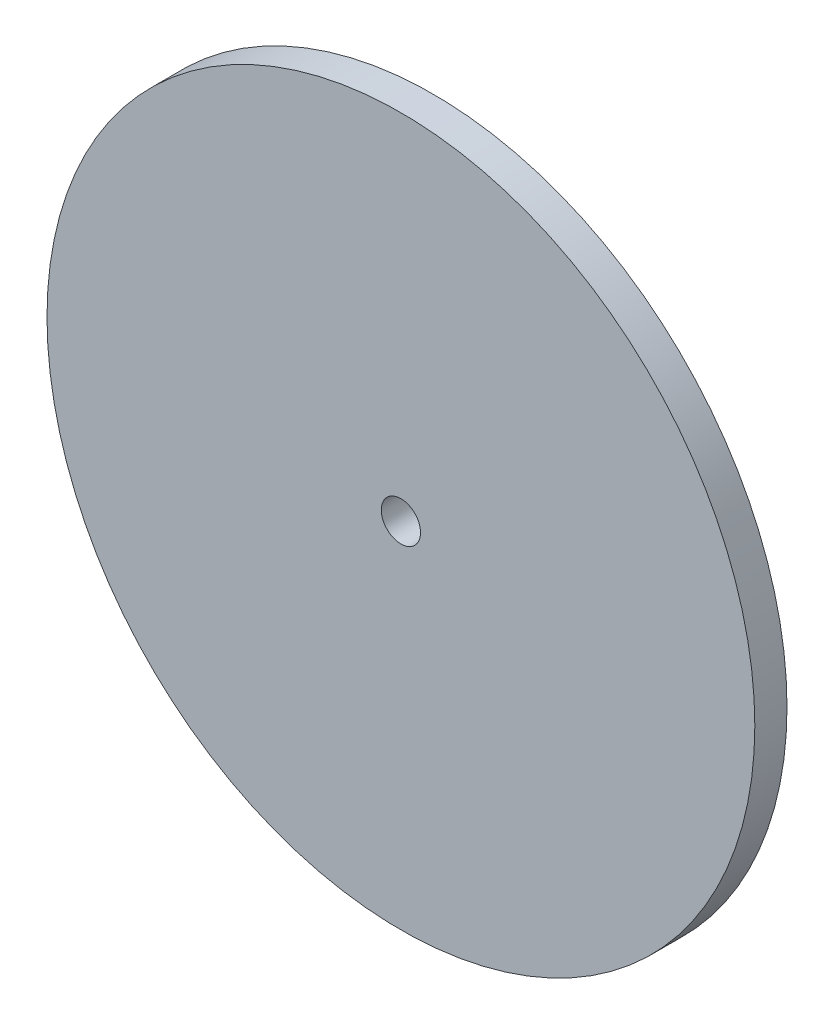
ISO-10303-21;
HEADER;
FILE_DESCRIPTION(('STEP AP214'),'2;1');
FILE_NAME('part.step','',(''),(''),'','','');
FILE_SCHEMA(('AUTOMOTIVE_DESIGN { 1 0 10303 214 1 1 1 1 }'));
ENDSEC;
DATA;
#1=APPLICATION_CONTEXT('core data for automotive mechanical design processes');
#2=APPLICATION_PROTOCOL_DEFINITION('international standard','automotive_design',2000,#1);
#3=PRODUCT_CONTEXT('',#1,'mechanical');
#4=PRODUCT('Part','Part','',(#3));
#5=PRODUCT_RELATED_PRODUCT_CATEGORY('part','',(#4));
#6=PRODUCT_DEFINITION_FORMATION('','',#4);
#7=PRODUCT_DEFINITION_CONTEXT('part definition',#1,'design');
#8=PRODUCT_DEFINITION('design','',#6,#7);
#9=PRODUCT_DEFINITION_SHAPE('','',#8);
#10=(LENGTH_UNIT() NAMED_UNIT(*) SI_UNIT(.MILLI.,.METRE.));
#11=(NAMED_UNIT(*) PLANE_ANGLE_UNIT() SI_UNIT($,.RADIAN.));
#12=(NAMED_UNIT(*) SI_UNIT($,.STERADIAN.) SOLID_ANGLE_UNIT());
#13=UNCERTAINTY_MEASURE_WITH_UNIT(LENGTH_MEASURE(1.E-05),#10,'distance_accuracy_value','');
#14=(GEOMETRIC_REPRESENTATION_CONTEXT(3) GLOBAL_UNCERTAINTY_ASSIGNED_CONTEXT((#13)) GLOBAL_UNIT_ASSIGNED_CONTEXT((#10,
#11,#12)) REPRESENTATION_CONTEXT('',''));
#15=CARTESIAN_POINT('',(0.,0.,0.));
#16=DIRECTION('',(0.,0.,1.));
#17=DIRECTION('',(1.,0.,0.));
#18=AXIS2_PLACEMENT_3D('',#15,#16,#17);
#19=CARTESIAN_POINT('',(0.,0.,5.));
#20=DIRECTION('',(0.,0.,1.));
#21=DIRECTION('',(1.,0.,0.));
#22=AXIS2_PLACEMENT_3D('',#19,#20,#21);
#23=PLANE('',#22);
#24=CARTESIAN_POINT('',(0.,0.,5.));
#25=DIRECTION('',(0.,0.,1.));
#26=DIRECTION('',(1.,0.,0.));
#27=AXIS2_PLACEMENT_3D('',#24,#25,#26);
#28=CIRCLE('',#27,55.);
#29=CARTESIAN_POINT('',(55.,0.,5.));
#30=VERTEX_POINT('',#29);
#31=EDGE_CURVE('E10',#30,#30,#28,.T.);
#32=ORIENTED_EDGE('',*,*,#31,.T.);
#33=EDGE_LOOP('',(#32));
#34=FACE_BOUND('',#33,.T.);
#35=CARTESIAN_POINT('',(0.,0.,5.));
#36=DIRECTION('',(0.,0.,1.));
#37=DIRECTION('',(1.,0.,0.));
#38=AXIS2_PLACEMENT_3D('',#35,#36,#37);
#39=CIRCLE('',#38,3.05);
#40=CARTESIAN_POINT('',(3.05,0.,5.));
#41=VERTEX_POINT('',#40);
#42=EDGE_CURVE('E46',#41,#41,#39,.T.);
#43=ORIENTED_EDGE('',*,*,#42,.F.);
#44=EDGE_LOOP('',(#43));
#45=FACE_BOUND('',#44,.T.);
#46=ADVANCED_FACE('F35',(#34,#45),#23,.T.);
#47=CARTESIAN_POINT('',(0.,0.,0.));
#48=DIRECTION('',(0.,0.,1.));
#49=DIRECTION('',(1.,0.,0.));
#50=AXIS2_PLACEMENT_3D('',#47,#48,#49);
#51=PLANE('',#50);
#52=CARTESIAN_POINT('',(0.,0.,0.));
#53=DIRECTION('',(0.,0.,1.));
#54=DIRECTION('',(1.,0.,0.));
#55=AXIS2_PLACEMENT_3D('',#52,#53,#54);
#56=CIRCLE('',#55,55.);
#57=CARTESIAN_POINT('',(55.,0.,0.));
#58=VERTEX_POINT('',#57);
#59=EDGE_CURVE('E39',#58,#58,#56,.T.);
#60=ORIENTED_EDGE('',*,*,#59,.F.);
#61=EDGE_LOOP('',(#60));
#62=FACE_BOUND('',#61,.T.);
#63=CARTESIAN_POINT('',(0.,0.,0.));
#64=DIRECTION('',(0.,0.,1.));
#65=DIRECTION('',(1.,0.,0.));
#66=AXIS2_PLACEMENT_3D('',#63,#64,#65);
#67=CIRCLE('',#66,3.05);
#68=CARTESIAN_POINT('',(3.05,0.,0.));
#69=VERTEX_POINT('',#68);
#70=EDGE_CURVE('E48',#69,#69,#67,.T.);
#71=ORIENTED_EDGE('',*,*,#70,.T.);
#72=EDGE_LOOP('',(#71));
#73=FACE_BOUND('',#72,.T.);
#74=ADVANCED_FACE('F58',(#62,#73),#51,.F.);
#75=CARTESIAN_POINT('',(0.,0.,5.));
#76=DIRECTION('',(0.,0.,-1.));
#77=DIRECTION('',(-1.,0.,0.));
#78=AXIS2_PLACEMENT_3D('',#75,#76,#77);
#79=CYLINDRICAL_SURFACE('',#78,55.);
#80=ORIENTED_EDGE('',*,*,#31,.F.);
#81=EDGE_LOOP('',(#80));
#82=FACE_BOUND('',#81,.T.);
#83=ORIENTED_EDGE('',*,*,#59,.T.);
#84=EDGE_LOOP('',(#83));
#85=FACE_BOUND('',#84,.T.);
#86=ADVANCED_FACE('F37',(#82,#85),#79,.T.);
#87=CARTESIAN_POINT('',(0.,0.,5.));
#88=DIRECTION('',(0.,0.,-1.));
#89=DIRECTION('',(-1.,0.,0.));
#90=AXIS2_PLACEMENT_3D('',#87,#88,#89);
#91=CYLINDRICAL_SURFACE('',#90,3.05);
#92=ORIENTED_EDGE('',*,*,#42,.T.);
#93=EDGE_LOOP('',(#92));
#94=FACE_BOUND('',#93,.T.);
#95=ORIENTED_EDGE('',*,*,#70,.F.);
#96=EDGE_LOOP('',(#95));
#97=FACE_BOUND('',#96,.T.);
#98=ADVANCED_FACE('F54',(#94,#97),#91,.F.);
#99=CLOSED_SHELL('',(#46,#74,#86,#98));
#100=MANIFOLD_SOLID_BREP('B2',#99);
#101=ADVANCED_BREP_SHAPE_REPRESENTATION('',(#18,#100),#14);
#102=SHAPE_DEFINITION_REPRESENTATION(#9,#101);
ENDSEC;
END-ISO-10303-21;
